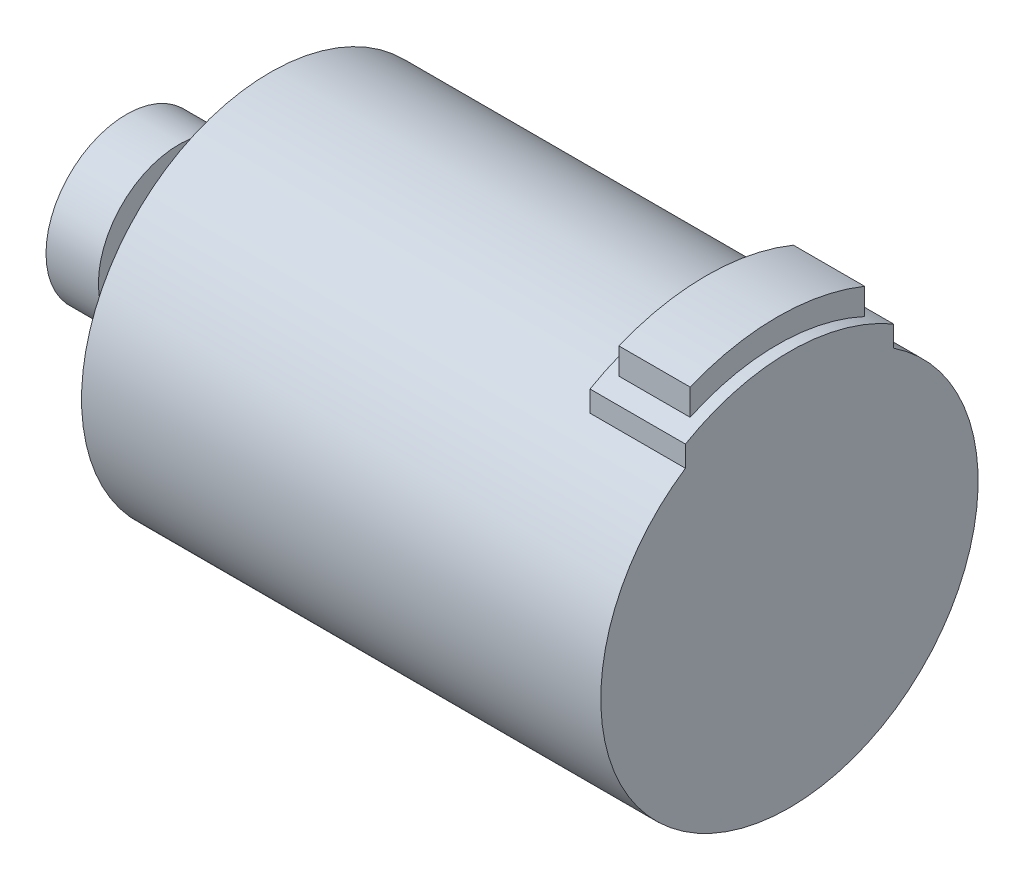
ISO-10303-21;
HEADER;
FILE_DESCRIPTION(('STEP AP214'),'2;1');
FILE_NAME('part.step','',(''),(''),'','','');
FILE_SCHEMA(('AUTOMOTIVE_DESIGN { 1 0 10303 214 1 1 1 1 }'));
ENDSEC;
DATA;
#1=APPLICATION_CONTEXT('core data for automotive mechanical design processes');
#2=APPLICATION_PROTOCOL_DEFINITION('international standard','automotive_design',2000,#1);
#3=PRODUCT_CONTEXT('',#1,'mechanical');
#4=PRODUCT('Part','Part','',(#3));
#5=PRODUCT_RELATED_PRODUCT_CATEGORY('part','',(#4));
#6=PRODUCT_DEFINITION_FORMATION('','',#4);
#7=PRODUCT_DEFINITION_CONTEXT('part definition',#1,'design');
#8=PRODUCT_DEFINITION('design','',#6,#7);
#9=PRODUCT_DEFINITION_SHAPE('','',#8);
#10=(LENGTH_UNIT() NAMED_UNIT(*) SI_UNIT(.MILLI.,.METRE.));
#11=(NAMED_UNIT(*) PLANE_ANGLE_UNIT() SI_UNIT($,.RADIAN.));
#12=(NAMED_UNIT(*) SI_UNIT($,.STERADIAN.) SOLID_ANGLE_UNIT());
#13=UNCERTAINTY_MEASURE_WITH_UNIT(LENGTH_MEASURE(1.E-05),#10,'distance_accuracy_value','');
#14=(GEOMETRIC_REPRESENTATION_CONTEXT(3) GLOBAL_UNCERTAINTY_ASSIGNED_CONTEXT((#13)) GLOBAL_UNIT_ASSIGNED_CONTEXT((#10,
#11,#12)) REPRESENTATION_CONTEXT('',''));
#15=CARTESIAN_POINT('',(0.,0.,0.));
#16=DIRECTION('',(0.,0.,1.));
#17=DIRECTION('',(1.,0.,0.));
#18=AXIS2_PLACEMENT_3D('',#15,#16,#17);
#19=CARTESIAN_POINT('',(49.54,0.,0.));
#20=DIRECTION('',(-1.,0.,0.));
#21=DIRECTION('',(0.,0.,1.));
#22=AXIS2_PLACEMENT_3D('',#19,#20,#21);
#23=CYLINDRICAL_SURFACE('',#22,18.);
#24=CARTESIAN_POINT('',(0.,0.,0.));
#25=DIRECTION('',(1.,0.,0.));
#26=DIRECTION('',(0.,0.,-1.));
#27=AXIS2_PLACEMENT_3D('',#24,#25,#26);
#28=CIRCLE('',#27,18.);
#29=CARTESIAN_POINT('',(0.,0.,-18.));
#30=VERTEX_POINT('',#29);
#31=EDGE_CURVE('E240',#30,#30,#28,.T.);
#32=ORIENTED_EDGE('',*,*,#31,.T.);
#33=EDGE_LOOP('',(#32));
#34=FACE_BOUND('',#33,.T.);
#35=DIRECTION('',(1.,0.,0.));
#36=VECTOR('',#35,1.);
#37=CARTESIAN_POINT('',(40.44,15.0164701245,9.925));
#38=LINE('',#37,#36);
#39=CARTESIAN_POINT('',(40.44,15.0164701245,9.925));
#40=VERTEX_POINT('',#39);
#41=CARTESIAN_POINT('',(49.54,15.0164701245,9.925));
#42=VERTEX_POINT('',#41);
#43=EDGE_CURVE('E173',#40,#42,#38,.T.);
#44=ORIENTED_EDGE('',*,*,#43,.F.);
#45=CARTESIAN_POINT('',(40.44,0.,0.));
#46=DIRECTION('',(1.,0.,0.));
#47=DIRECTION('',(0.,0.,-1.));
#48=AXIS2_PLACEMENT_3D('',#45,#46,#47);
#49=CIRCLE('',#48,18.);
#50=CARTESIAN_POINT('',(40.44,15.0164701245,-9.925));
#51=VERTEX_POINT('',#50);
#52=EDGE_CURVE('E155',#51,#40,#49,.T.);
#53=ORIENTED_EDGE('',*,*,#52,.F.);
#54=DIRECTION('',(1.,0.,0.));
#55=VECTOR('',#54,1.);
#56=CARTESIAN_POINT('',(40.44,15.0164701245,-9.925));
#57=LINE('',#56,#55);
#58=CARTESIAN_POINT('',(49.54,15.0164701245,-9.925));
#59=VERTEX_POINT('',#58);
#60=EDGE_CURVE('E166',#51,#59,#57,.T.);
#61=ORIENTED_EDGE('',*,*,#60,.T.);
#62=CARTESIAN_POINT('',(49.54,0.,0.));
#63=DIRECTION('',(1.,0.,0.));
#64=DIRECTION('',(0.,0.,-1.));
#65=AXIS2_PLACEMENT_3D('',#62,#63,#64);
#66=CIRCLE('',#65,18.);
#67=EDGE_CURVE('E241',#42,#59,#66,.T.);
#68=ORIENTED_EDGE('',*,*,#67,.F.);
#69=EDGE_LOOP('',(#44,#53,#61,#68));
#70=FACE_BOUND('',#69,.T.);
#71=ADVANCED_FACE('F37',(#34,#70),#23,.T.);
#72=CARTESIAN_POINT('',(-15.2,0.,0.));
#73=DIRECTION('',(1.,0.,0.));
#74=DIRECTION('',(0.,0.,-1.));
#75=AXIS2_PLACEMENT_3D('',#72,#73,#74);
#76=CYLINDRICAL_SURFACE('',#75,1.575);
#77=CARTESIAN_POINT('',(-2.5,0.,0.));
#78=DIRECTION('',(-1.,0.,0.));
#79=DIRECTION('',(0.,0.,1.));
#80=AXIS2_PLACEMENT_3D('',#77,#78,#79);
#81=CIRCLE('',#80,1.575);
#82=CARTESIAN_POINT('',(-2.5,0.,1.575));
#83=VERTEX_POINT('',#82);
#84=EDGE_CURVE('E235',#83,#83,#81,.T.);
#85=ORIENTED_EDGE('',*,*,#84,.T.);
#86=EDGE_LOOP('',(#85));
#87=FACE_BOUND('',#86,.T.);
#88=CARTESIAN_POINT('',(-4.69,0.,0.));
#89=DIRECTION('',(-1.,0.,0.));
#90=DIRECTION('',(0.,0.,1.));
#91=AXIS2_PLACEMENT_3D('',#88,#89,#90);
#92=CIRCLE('',#91,1.575);
#93=CARTESIAN_POINT('',(-4.69,0.,1.575));
#94=VERTEX_POINT('',#93);
#95=EDGE_CURVE('E11',#94,#94,#92,.T.);
#96=ORIENTED_EDGE('',*,*,#95,.F.);
#97=EDGE_LOOP('',(#96));
#98=FACE_BOUND('',#97,.T.);
#99=ADVANCED_FACE('F267',(#87,#98),#76,.T.);
#100=CARTESIAN_POINT('',(-2.5,0.,0.));
#101=DIRECTION('',(-1.,0.,0.));
#102=DIRECTION('',(0.,0.,1.));
#103=AXIS2_PLACEMENT_3D('',#100,#101,#102);
#104=PLANE('',#103);
#105=CARTESIAN_POINT('',(-2.5,0.,0.));
#106=DIRECTION('',(-1.,0.,0.));
#107=DIRECTION('',(0.,0.,1.));
#108=AXIS2_PLACEMENT_3D('',#105,#106,#107);
#109=CIRCLE('',#108,2.495);
#110=CARTESIAN_POINT('',(-2.5,0.,2.495));
#111=VERTEX_POINT('',#110);
#112=EDGE_CURVE('E234',#111,#111,#109,.T.);
#113=ORIENTED_EDGE('',*,*,#112,.T.);
#114=EDGE_LOOP('',(#113));
#115=FACE_BOUND('',#114,.T.);
#116=ORIENTED_EDGE('',*,*,#84,.F.);
#117=EDGE_LOOP('',(#116));
#118=FACE_BOUND('',#117,.T.);
#119=ADVANCED_FACE('F276',(#115,#118),#104,.T.);
#120=CARTESIAN_POINT('',(0.,0.,0.));
#121=DIRECTION('',(1.,0.,0.));
#122=DIRECTION('',(0.,0.,-1.));
#123=AXIS2_PLACEMENT_3D('',#120,#121,#122);
#124=PLANE('',#123);
#125=CARTESIAN_POINT('',(0.,0.,12.5));
#126=DIRECTION('',(-1.,0.,0.));
#127=DIRECTION('',(0.,0.,1.));
#128=AXIS2_PLACEMENT_3D('',#125,#126,#127);
#129=CIRCLE('',#128,1.24999999999999);
#130=CARTESIAN_POINT('',(0.,0.,13.75));
#131=VERTEX_POINT('',#130);
#132=EDGE_CURVE('E175',#131,#131,#129,.T.);
#133=ORIENTED_EDGE('',*,*,#132,.F.);
#134=EDGE_LOOP('',(#133));
#135=FACE_BOUND('',#134,.T.);
#136=CARTESIAN_POINT('',(0.,-10.8253175473055,6.25));
#137=DIRECTION('',(-1.,0.,0.));
#138=DIRECTION('',(0.,0.,1.));
#139=AXIS2_PLACEMENT_3D('',#136,#137,#138);
#140=CIRCLE('',#139,1.24999999999999);
#141=CARTESIAN_POINT('',(0.,-10.8253175473055,7.49999999999999));
#142=VERTEX_POINT('',#141);
#143=EDGE_CURVE('E188',#142,#142,#140,.T.);
#144=ORIENTED_EDGE('',*,*,#143,.F.);
#145=EDGE_LOOP('',(#144));
#146=FACE_BOUND('',#145,.T.);
#147=CARTESIAN_POINT('',(0.,-10.8253175473055,-6.25));
#148=DIRECTION('',(-1.,0.,0.));
#149=DIRECTION('',(0.,0.,1.));
#150=AXIS2_PLACEMENT_3D('',#147,#148,#149);
#151=CIRCLE('',#150,1.24999999999999);
#152=CARTESIAN_POINT('',(0.,-10.8253175473055,-5.00000000000001));
#153=VERTEX_POINT('',#152);
#154=EDGE_CURVE('E194',#153,#153,#151,.T.);
#155=ORIENTED_EDGE('',*,*,#154,.F.);
#156=EDGE_LOOP('',(#155));
#157=FACE_BOUND('',#156,.T.);
#158=CARTESIAN_POINT('',(0.,0.,-12.5));
#159=DIRECTION('',(-1.,0.,0.));
#160=DIRECTION('',(0.,0.,1.));
#161=AXIS2_PLACEMENT_3D('',#158,#159,#160);
#162=CIRCLE('',#161,1.24999999999999);
#163=CARTESIAN_POINT('',(0.,0.,-11.25));
#164=VERTEX_POINT('',#163);
#165=EDGE_CURVE('E200',#164,#164,#162,.T.);
#166=ORIENTED_EDGE('',*,*,#165,.F.);
#167=EDGE_LOOP('',(#166));
#168=FACE_BOUND('',#167,.T.);
#169=CARTESIAN_POINT('',(0.,10.8253175473055,-6.25000000000001));
#170=DIRECTION('',(-1.,0.,0.));
#171=DIRECTION('',(0.,0.,1.));
#172=AXIS2_PLACEMENT_3D('',#169,#170,#171);
#173=CIRCLE('',#172,1.24999999999999);
#174=CARTESIAN_POINT('',(0.,10.8253175473055,-5.00000000000002));
#175=VERTEX_POINT('',#174);
#176=EDGE_CURVE('E206',#175,#175,#173,.T.);
#177=ORIENTED_EDGE('',*,*,#176,.F.);
#178=EDGE_LOOP('',(#177));
#179=FACE_BOUND('',#178,.T.);
#180=CARTESIAN_POINT('',(0.,10.8253175473055,6.25));
#181=DIRECTION('',(-1.,0.,0.));
#182=DIRECTION('',(0.,0.,1.));
#183=AXIS2_PLACEMENT_3D('',#180,#181,#182);
#184=CIRCLE('',#183,1.24999999999999);
#185=CARTESIAN_POINT('',(0.,10.8253175473055,7.49999999999999));
#186=VERTEX_POINT('',#185);
#187=EDGE_CURVE('E212',#186,#186,#184,.T.);
#188=ORIENTED_EDGE('',*,*,#187,.F.);
#189=EDGE_LOOP('',(#188));
#190=FACE_BOUND('',#189,.T.);
#191=ORIENTED_EDGE('',*,*,#31,.F.);
#192=EDGE_LOOP('',(#191));
#193=FACE_BOUND('',#192,.T.);
#194=CARTESIAN_POINT('',(0.,0.,0.));
#195=DIRECTION('',(1.,0.,0.));
#196=DIRECTION('',(0.,0.,-1.));
#197=AXIS2_PLACEMENT_3D('',#194,#195,#196);
#198=CIRCLE('',#197,2.495);
#199=CARTESIAN_POINT('',(0.,0.,-2.495));
#200=VERTEX_POINT('',#199);
#201=EDGE_CURVE('E44',#200,#200,#198,.F.);
#202=ORIENTED_EDGE('',*,*,#201,.F.);
#203=EDGE_LOOP('',(#202));
#204=FACE_BOUND('',#203,.T.);
#205=ADVANCED_FACE('F389',(#135,#146,#157,#168,#179,#190,#193,#204),#124,.F.);
#206=CARTESIAN_POINT('',(49.54,0.,0.));
#207=DIRECTION('',(1.,0.,0.));
#208=DIRECTION('',(0.,0.,-1.));
#209=AXIS2_PLACEMENT_3D('',#206,#207,#208);
#210=PLANE('',#209);
#211=ORIENTED_EDGE('',*,*,#67,.T.);
#212=DIRECTION('',(0.,1.,0.));
#213=VECTOR('',#212,1.);
#214=CARTESIAN_POINT('',(49.54,0.,-9.925));
#215=LINE('',#214,#213);
#216=CARTESIAN_POINT('',(49.54,17.0164701245,-9.925));
#217=VERTEX_POINT('',#216);
#218=EDGE_CURVE('E154',#59,#217,#215,.T.);
#219=ORIENTED_EDGE('',*,*,#218,.T.);
#220=CARTESIAN_POINT('',(49.54,0.,0.));
#221=DIRECTION('',(1.,0.,0.));
#222=DIRECTION('',(0.,0.,-1.));
#223=AXIS2_PLACEMENT_3D('',#220,#221,#222);
#224=CIRCLE('',#223,19.6993878203867);
#225=CARTESIAN_POINT('',(49.54,17.0164701245,9.925));
#226=VERTEX_POINT('',#225);
#227=EDGE_CURVE('E169',#226,#217,#224,.F.);
#228=ORIENTED_EDGE('',*,*,#227,.F.);
#229=DIRECTION('',(0.,1.,0.));
#230=VECTOR('',#229,1.);
#231=CARTESIAN_POINT('',(49.54,0.,9.925));
#232=LINE('',#231,#230);
#233=EDGE_CURVE('E159',#42,#226,#232,.T.);
#234=ORIENTED_EDGE('',*,*,#233,.F.);
#235=EDGE_LOOP('',(#211,#219,#228,#234));
#236=FACE_BOUND('',#235,.T.);
#237=ADVANCED_FACE('F289',(#236),#210,.T.);
#238=CARTESIAN_POINT('',(-2.5,0.,0.));
#239=DIRECTION('',(1.,0.,0.));
#240=DIRECTION('',(0.,0.,-1.));
#241=AXIS2_PLACEMENT_3D('',#238,#239,#240);
#242=CYLINDRICAL_SURFACE('',#241,2.495);
#243=ORIENTED_EDGE('',*,*,#112,.F.);
#244=EDGE_LOOP('',(#243));
#245=FACE_BOUND('',#244,.T.);
#246=ORIENTED_EDGE('',*,*,#201,.T.);
#247=EDGE_LOOP('',(#246));
#248=FACE_BOUND('',#247,.T.);
#249=ADVANCED_FACE('F362',(#245,#248),#242,.T.);
#250=CARTESIAN_POINT('',(-4.69,0.,0.));
#251=DIRECTION('',(-1.,0.,0.));
#252=DIRECTION('',(0.,0.,1.));
#253=AXIS2_PLACEMENT_3D('',#250,#251,#252);
#254=PLANE('',#253);
#255=CARTESIAN_POINT('',(-4.69,0.,0.));
#256=DIRECTION('',(-1.,0.,0.));
#257=DIRECTION('',(0.,0.,1.));
#258=AXIS2_PLACEMENT_3D('',#255,#256,#257);
#259=CIRCLE('',#258,4.01);
#260=CARTESIAN_POINT('',(-4.69,0.,4.01));
#261=VERTEX_POINT('',#260);
#262=EDGE_CURVE('E218',#261,#261,#259,.T.);
#263=ORIENTED_EDGE('',*,*,#262,.F.);
#264=EDGE_LOOP('',(#263));
#265=FACE_BOUND('',#264,.T.);
#266=ORIENTED_EDGE('',*,*,#95,.T.);
#267=EDGE_LOOP('',(#266));
#268=FACE_BOUND('',#267,.T.);
#269=ADVANCED_FACE('F358',(#265,#268),#254,.F.);
#270=CARTESIAN_POINT('',(-4.69,0.,0.));
#271=DIRECTION('',(-1.,0.,0.));
#272=DIRECTION('',(0.,0.,1.));
#273=AXIS2_PLACEMENT_3D('',#270,#271,#272);
#274=CYLINDRICAL_SURFACE('',#273,4.01);
#275=ORIENTED_EDGE('',*,*,#262,.T.);
#276=EDGE_LOOP('',(#275));
#277=FACE_BOUND('',#276,.T.);
#278=CARTESIAN_POINT('',(-8.72,0.,0.));
#279=DIRECTION('',(-1.,0.,0.));
#280=DIRECTION('',(0.,0.,1.));
#281=AXIS2_PLACEMENT_3D('',#278,#279,#280);
#282=CIRCLE('',#281,4.01);
#283=CARTESIAN_POINT('',(-8.72,0.,4.01));
#284=VERTEX_POINT('',#283);
#285=EDGE_CURVE('E221',#284,#284,#282,.T.);
#286=ORIENTED_EDGE('',*,*,#285,.F.);
#287=EDGE_LOOP('',(#286));
#288=FACE_BOUND('',#287,.T.);
#289=ADVANCED_FACE('F361',(#277,#288),#274,.T.);
#290=CARTESIAN_POINT('',(-15.2,0.,0.));
#291=DIRECTION('',(-1.,0.,0.));
#292=DIRECTION('',(0.,0.,1.));
#293=AXIS2_PLACEMENT_3D('',#290,#291,#292);
#294=PLANE('',#293);
#295=CARTESIAN_POINT('',(-15.2,0.,0.));
#296=DIRECTION('',(-1.,0.,0.));
#297=DIRECTION('',(0.,0.,1.));
#298=AXIS2_PLACEMENT_3D('',#295,#296,#297);
#299=CIRCLE('',#298,1.575);
#300=CARTESIAN_POINT('',(-15.2,0.,1.575));
#301=VERTEX_POINT('',#300);
#302=EDGE_CURVE('E231',#301,#301,#299,.T.);
#303=ORIENTED_EDGE('',*,*,#302,.T.);
#304=EDGE_LOOP('',(#303));
#305=FACE_BOUND('',#304,.T.);
#306=ADVANCED_FACE('F265',(#305),#294,.T.);
#307=CARTESIAN_POINT('',(-13.72,0.,0.));
#308=DIRECTION('',(-1.,0.,0.));
#309=DIRECTION('',(0.,0.,1.));
#310=AXIS2_PLACEMENT_3D('',#307,#308,#309);
#311=CIRCLE('',#310,1.575);
#312=CARTESIAN_POINT('',(-13.72,0.,1.575));
#313=VERTEX_POINT('',#312);
#314=EDGE_CURVE('E228',#313,#313,#311,.T.);
#315=ORIENTED_EDGE('',*,*,#314,.T.);
#316=EDGE_LOOP('',(#315));
#317=FACE_BOUND('',#316,.T.);
#318=ORIENTED_EDGE('',*,*,#302,.F.);
#319=EDGE_LOOP('',(#318));
#320=FACE_BOUND('',#319,.T.);
#321=ADVANCED_FACE('F250',(#317,#320),#76,.T.);
#322=CARTESIAN_POINT('',(-13.72,0.,0.));
#323=DIRECTION('',(-1.,0.,0.));
#324=DIRECTION('',(0.,0.,1.));
#325=AXIS2_PLACEMENT_3D('',#322,#323,#324);
#326=PLANE('',#325);
#327=CARTESIAN_POINT('',(-13.72,0.,0.));
#328=DIRECTION('',(-1.,0.,0.));
#329=DIRECTION('',(0.,0.,1.));
#330=AXIS2_PLACEMENT_3D('',#327,#328,#329);
#331=CIRCLE('',#330,7.67);
#332=CARTESIAN_POINT('',(-13.72,0.,7.67));
#333=VERTEX_POINT('',#332);
#334=EDGE_CURVE('E224',#333,#333,#331,.T.);
#335=ORIENTED_EDGE('',*,*,#334,.T.);
#336=EDGE_LOOP('',(#335));
#337=FACE_BOUND('',#336,.T.);
#338=ORIENTED_EDGE('',*,*,#314,.F.);
#339=EDGE_LOOP('',(#338));
#340=FACE_BOUND('',#339,.T.);
#341=ADVANCED_FACE('F253',(#337,#340),#326,.T.);
#342=CARTESIAN_POINT('',(-8.72,0.,0.));
#343=DIRECTION('',(-1.,0.,0.));
#344=DIRECTION('',(0.,0.,1.));
#345=AXIS2_PLACEMENT_3D('',#342,#343,#344);
#346=CYLINDRICAL_SURFACE('',#345,7.67);
#347=CARTESIAN_POINT('',(-8.72,0.,0.));
#348=DIRECTION('',(-1.,0.,0.));
#349=DIRECTION('',(0.,0.,1.));
#350=AXIS2_PLACEMENT_3D('',#347,#348,#349);
#351=CIRCLE('',#350,7.67);
#352=CARTESIAN_POINT('',(-8.72,0.,7.67));
#353=VERTEX_POINT('',#352);
#354=EDGE_CURVE('E225',#353,#353,#351,.T.);
#355=ORIENTED_EDGE('',*,*,#354,.T.);
#356=EDGE_LOOP('',(#355));
#357=FACE_BOUND('',#356,.T.);
#358=ORIENTED_EDGE('',*,*,#334,.F.);
#359=EDGE_LOOP('',(#358));
#360=FACE_BOUND('',#359,.T.);
#361=ADVANCED_FACE('F255',(#357,#360),#346,.T.);
#362=CARTESIAN_POINT('',(-8.72,0.,0.));
#363=DIRECTION('',(-1.,0.,0.));
#364=DIRECTION('',(0.,0.,1.));
#365=AXIS2_PLACEMENT_3D('',#362,#363,#364);
#366=PLANE('',#365);
#367=ORIENTED_EDGE('',*,*,#285,.T.);
#368=EDGE_LOOP('',(#367));
#369=FACE_BOUND('',#368,.T.);
#370=ORIENTED_EDGE('',*,*,#354,.F.);
#371=EDGE_LOOP('',(#370));
#372=FACE_BOUND('',#371,.T.);
#373=ADVANCED_FACE('F262',(#369,#372),#366,.F.);
#374=CARTESIAN_POINT('',(9.00000000000001,10.8253175473055,6.25));
#375=DIRECTION('',(-1.,0.,0.));
#376=DIRECTION('',(0.,0.,1.));
#377=AXIS2_PLACEMENT_3D('',#374,#375,#376);
#378=CONICAL_SURFACE('',#377,1.24999999999999,1.02974425867665);
#379=CARTESIAN_POINT('',(9.75107577378445,10.8253175473055,6.25));
#380=VERTEX_POINT('',#379);
#381=VERTEX_LOOP('',#380);
#382=FACE_BOUND('',#381,.T.);
#383=CARTESIAN_POINT('',(9.00000000000001,10.8253175473055,6.25));
#384=DIRECTION('',(-1.,0.,0.));
#385=DIRECTION('',(0.,0.,1.));
#386=AXIS2_PLACEMENT_3D('',#383,#384,#385);
#387=CIRCLE('',#386,1.24999999999999);
#388=CARTESIAN_POINT('',(9.00000000000001,10.8253175473055,7.49999999999999));
#389=VERTEX_POINT('',#388);
#390=EDGE_CURVE('E215',#389,#389,#387,.T.);
#391=ORIENTED_EDGE('',*,*,#390,.T.);
#392=EDGE_LOOP('',(#391));
#393=FACE_BOUND('',#392,.T.);
#394=ADVANCED_FACE('F353',(#382,#393),#378,.F.);
#395=CARTESIAN_POINT('',(0.,10.8253175473055,6.25));
#396=DIRECTION('',(-1.,0.,0.));
#397=DIRECTION('',(0.,0.,1.));
#398=AXIS2_PLACEMENT_3D('',#395,#396,#397);
#399=CYLINDRICAL_SURFACE('',#398,1.24999999999999);
#400=ORIENTED_EDGE('',*,*,#390,.F.);
#401=EDGE_LOOP('',(#400));
#402=FACE_BOUND('',#401,.T.);
#403=ORIENTED_EDGE('',*,*,#187,.T.);
#404=EDGE_LOOP('',(#403));
#405=FACE_BOUND('',#404,.T.);
#406=ADVANCED_FACE('F349',(#402,#405),#399,.F.);
#407=CARTESIAN_POINT('',(9.00000000000001,10.8253175473055,-6.25000000000001));
#408=DIRECTION('',(-1.,0.,0.));
#409=DIRECTION('',(0.,0.,1.));
#410=AXIS2_PLACEMENT_3D('',#407,#408,#409);
#411=CONICAL_SURFACE('',#410,1.24999999999999,1.02974425867665);
#412=CARTESIAN_POINT('',(9.75107577378445,10.8253175473055,-6.25000000000001));
#413=VERTEX_POINT('',#412);
#414=VERTEX_LOOP('',#413);
#415=FACE_BOUND('',#414,.T.);
#416=CARTESIAN_POINT('',(9.00000000000001,10.8253175473055,-6.25000000000001));
#417=DIRECTION('',(-1.,0.,0.));
#418=DIRECTION('',(0.,0.,1.));
#419=AXIS2_PLACEMENT_3D('',#416,#417,#418);
#420=CIRCLE('',#419,1.24999999999999);
#421=CARTESIAN_POINT('',(9.00000000000001,10.8253175473055,-5.00000000000002));
#422=VERTEX_POINT('',#421);
#423=EDGE_CURVE('E209',#422,#422,#420,.T.);
#424=ORIENTED_EDGE('',*,*,#423,.T.);
#425=EDGE_LOOP('',(#424));
#426=FACE_BOUND('',#425,.T.);
#427=ADVANCED_FACE('F345',(#415,#426),#411,.F.);
#428=CARTESIAN_POINT('',(0.,10.8253175473055,-6.25000000000001));
#429=DIRECTION('',(-1.,0.,0.));
#430=DIRECTION('',(0.,0.,1.));
#431=AXIS2_PLACEMENT_3D('',#428,#429,#430);
#432=CYLINDRICAL_SURFACE('',#431,1.24999999999999);
#433=ORIENTED_EDGE('',*,*,#423,.F.);
#434=EDGE_LOOP('',(#433));
#435=FACE_BOUND('',#434,.T.);
#436=ORIENTED_EDGE('',*,*,#176,.T.);
#437=EDGE_LOOP('',(#436));
#438=FACE_BOUND('',#437,.T.);
#439=ADVANCED_FACE('F341',(#435,#438),#432,.F.);
#440=CARTESIAN_POINT('',(9.00000000000001,0.,-12.5));
#441=DIRECTION('',(-1.,0.,0.));
#442=DIRECTION('',(0.,0.,1.));
#443=AXIS2_PLACEMENT_3D('',#440,#441,#442);
#444=CONICAL_SURFACE('',#443,1.24999999999999,1.02974425867665);
#445=CARTESIAN_POINT('',(9.75107577378445,0.,-12.5));
#446=VERTEX_POINT('',#445);
#447=VERTEX_LOOP('',#446);
#448=FACE_BOUND('',#447,.T.);
#449=CARTESIAN_POINT('',(9.00000000000001,0.,-12.5));
#450=DIRECTION('',(-1.,0.,0.));
#451=DIRECTION('',(0.,0.,1.));
#452=AXIS2_PLACEMENT_3D('',#449,#450,#451);
#453=CIRCLE('',#452,1.24999999999999);
#454=CARTESIAN_POINT('',(9.00000000000001,0.,-11.25));
#455=VERTEX_POINT('',#454);
#456=EDGE_CURVE('E203',#455,#455,#453,.T.);
#457=ORIENTED_EDGE('',*,*,#456,.T.);
#458=EDGE_LOOP('',(#457));
#459=FACE_BOUND('',#458,.T.);
#460=ADVANCED_FACE('F337',(#448,#459),#444,.F.);
#461=CARTESIAN_POINT('',(0.,0.,-12.5));
#462=DIRECTION('',(-1.,0.,0.));
#463=DIRECTION('',(0.,0.,1.));
#464=AXIS2_PLACEMENT_3D('',#461,#462,#463);
#465=CYLINDRICAL_SURFACE('',#464,1.24999999999999);
#466=ORIENTED_EDGE('',*,*,#456,.F.);
#467=EDGE_LOOP('',(#466));
#468=FACE_BOUND('',#467,.T.);
#469=ORIENTED_EDGE('',*,*,#165,.T.);
#470=EDGE_LOOP('',(#469));
#471=FACE_BOUND('',#470,.T.);
#472=ADVANCED_FACE('F333',(#468,#471),#465,.F.);
#473=CARTESIAN_POINT('',(9.00000000000001,-10.8253175473055,-6.25));
#474=DIRECTION('',(-1.,0.,0.));
#475=DIRECTION('',(0.,0.,1.));
#476=AXIS2_PLACEMENT_3D('',#473,#474,#475);
#477=CONICAL_SURFACE('',#476,1.24999999999999,1.02974425867665);
#478=CARTESIAN_POINT('',(9.75107577378445,-10.8253175473055,-6.25));
#479=VERTEX_POINT('',#478);
#480=VERTEX_LOOP('',#479);
#481=FACE_BOUND('',#480,.T.);
#482=CARTESIAN_POINT('',(9.00000000000001,-10.8253175473055,-6.25));
#483=DIRECTION('',(-1.,0.,0.));
#484=DIRECTION('',(0.,0.,1.));
#485=AXIS2_PLACEMENT_3D('',#482,#483,#484);
#486=CIRCLE('',#485,1.24999999999999);
#487=CARTESIAN_POINT('',(9.00000000000001,-10.8253175473055,-5.00000000000001));
#488=VERTEX_POINT('',#487);
#489=EDGE_CURVE('E197',#488,#488,#486,.T.);
#490=ORIENTED_EDGE('',*,*,#489,.T.);
#491=EDGE_LOOP('',(#490));
#492=FACE_BOUND('',#491,.T.);
#493=ADVANCED_FACE('F329',(#481,#492),#477,.F.);
#494=CARTESIAN_POINT('',(0.,-10.8253175473055,-6.25));
#495=DIRECTION('',(-1.,0.,0.));
#496=DIRECTION('',(0.,0.,1.));
#497=AXIS2_PLACEMENT_3D('',#494,#495,#496);
#498=CYLINDRICAL_SURFACE('',#497,1.24999999999999);
#499=ORIENTED_EDGE('',*,*,#489,.F.);
#500=EDGE_LOOP('',(#499));
#501=FACE_BOUND('',#500,.T.);
#502=ORIENTED_EDGE('',*,*,#154,.T.);
#503=EDGE_LOOP('',(#502));
#504=FACE_BOUND('',#503,.T.);
#505=ADVANCED_FACE('F325',(#501,#504),#498,.F.);
#506=CARTESIAN_POINT('',(9.00000000000001,-10.8253175473055,6.25));
#507=DIRECTION('',(-1.,0.,0.));
#508=DIRECTION('',(0.,0.,1.));
#509=AXIS2_PLACEMENT_3D('',#506,#507,#508);
#510=CONICAL_SURFACE('',#509,1.24999999999999,1.02974425867665);
#511=CARTESIAN_POINT('',(9.75107577378445,-10.8253175473055,6.25));
#512=VERTEX_POINT('',#511);
#513=VERTEX_LOOP('',#512);
#514=FACE_BOUND('',#513,.T.);
#515=CARTESIAN_POINT('',(9.00000000000001,-10.8253175473055,6.25));
#516=DIRECTION('',(-1.,0.,0.));
#517=DIRECTION('',(0.,0.,1.));
#518=AXIS2_PLACEMENT_3D('',#515,#516,#517);
#519=CIRCLE('',#518,1.24999999999999);
#520=CARTESIAN_POINT('',(9.00000000000001,-10.8253175473055,7.49999999999999));
#521=VERTEX_POINT('',#520);
#522=EDGE_CURVE('E191',#521,#521,#519,.T.);
#523=ORIENTED_EDGE('',*,*,#522,.T.);
#524=EDGE_LOOP('',(#523));
#525=FACE_BOUND('',#524,.T.);
#526=ADVANCED_FACE('F321',(#514,#525),#510,.F.);
#527=CARTESIAN_POINT('',(0.,-10.8253175473055,6.25));
#528=DIRECTION('',(-1.,0.,0.));
#529=DIRECTION('',(0.,0.,1.));
#530=AXIS2_PLACEMENT_3D('',#527,#528,#529);
#531=CYLINDRICAL_SURFACE('',#530,1.24999999999999);
#532=ORIENTED_EDGE('',*,*,#522,.F.);
#533=EDGE_LOOP('',(#532));
#534=FACE_BOUND('',#533,.T.);
#535=ORIENTED_EDGE('',*,*,#143,.T.);
#536=EDGE_LOOP('',(#535));
#537=FACE_BOUND('',#536,.T.);
#538=ADVANCED_FACE('F317',(#534,#537),#531,.F.);
#539=CARTESIAN_POINT('',(9.00000000000001,0.,12.5));
#540=DIRECTION('',(-1.,0.,0.));
#541=DIRECTION('',(0.,0.,1.));
#542=AXIS2_PLACEMENT_3D('',#539,#540,#541);
#543=CONICAL_SURFACE('',#542,1.24999999999999,1.02974425867665);
#544=CARTESIAN_POINT('',(9.75107577378445,0.,12.5));
#545=VERTEX_POINT('',#544);
#546=VERTEX_LOOP('',#545);
#547=FACE_BOUND('',#546,.T.);
#548=CARTESIAN_POINT('',(9.00000000000001,0.,12.5));
#549=DIRECTION('',(-1.,0.,0.));
#550=DIRECTION('',(0.,0.,1.));
#551=AXIS2_PLACEMENT_3D('',#548,#549,#550);
#552=CIRCLE('',#551,1.24999999999999);
#553=CARTESIAN_POINT('',(9.00000000000001,0.,13.75));
#554=VERTEX_POINT('',#553);
#555=EDGE_CURVE('E185',#554,#554,#552,.T.);
#556=ORIENTED_EDGE('',*,*,#555,.T.);
#557=EDGE_LOOP('',(#556));
#558=FACE_BOUND('',#557,.T.);
#559=ADVANCED_FACE('F313',(#547,#558),#543,.F.);
#560=CARTESIAN_POINT('',(0.,0.,12.5));
#561=DIRECTION('',(-1.,0.,0.));
#562=DIRECTION('',(0.,0.,1.));
#563=AXIS2_PLACEMENT_3D('',#560,#561,#562);
#564=CYLINDRICAL_SURFACE('',#563,1.24999999999999);
#565=ORIENTED_EDGE('',*,*,#555,.F.);
#566=EDGE_LOOP('',(#565));
#567=FACE_BOUND('',#566,.T.);
#568=ORIENTED_EDGE('',*,*,#132,.T.);
#569=EDGE_LOOP('',(#568));
#570=FACE_BOUND('',#569,.T.);
#571=ADVANCED_FACE('F310',(#567,#570),#564,.F.);
#572=CARTESIAN_POINT('',(40.44,0.,9.925));
#573=DIRECTION('',(0.,0.,-1.));
#574=DIRECTION('',(-1.,0.,0.));
#575=AXIS2_PLACEMENT_3D('',#572,#573,#574);
#576=PLANE('',#575);
#577=ORIENTED_EDGE('',*,*,#233,.T.);
#578=DIRECTION('',(1.,0.,0.));
#579=VECTOR('',#578,1.);
#580=CARTESIAN_POINT('',(40.44,17.0164701245,9.925));
#581=LINE('',#580,#579);
#582=CARTESIAN_POINT('',(40.44,17.0164701245,9.925));
#583=VERTEX_POINT('',#582);
#584=EDGE_CURVE('E176',#583,#226,#581,.T.);
#585=ORIENTED_EDGE('',*,*,#584,.F.);
#586=DIRECTION('',(0.,1.,0.));
#587=VECTOR('',#586,1.);
#588=CARTESIAN_POINT('',(40.44,0.,9.925));
#589=LINE('',#588,#587);
#590=EDGE_CURVE('E164',#40,#583,#589,.T.);
#591=ORIENTED_EDGE('',*,*,#590,.F.);
#592=ORIENTED_EDGE('',*,*,#43,.T.);
#593=EDGE_LOOP('',(#577,#585,#591,#592));
#594=FACE_BOUND('',#593,.T.);
#595=ADVANCED_FACE('F285',(#594),#576,.F.);
#596=CARTESIAN_POINT('',(40.44,0.,0.));
#597=DIRECTION('',(1.,0.,0.));
#598=DIRECTION('',(0.,0.,-1.));
#599=AXIS2_PLACEMENT_3D('',#596,#597,#598);
#600=CYLINDRICAL_SURFACE('',#599,19.6993878203867);
#601=DIRECTION('',(-1.,0.,0.));
#602=VECTOR('',#601,1.);
#603=CARTESIAN_POINT('',(48.39,17.8538582804322,-8.32499999998842));
#604=LINE('',#603,#602);
#605=CARTESIAN_POINT('',(48.39,17.8538582804444,-8.32499999998842));
#606=VERTEX_POINT('',#605);
#607=CARTESIAN_POINT('',(41.59,17.8538582804444,-8.32499999998842));
#608=VERTEX_POINT('',#607);
#609=EDGE_CURVE('E56',#606,#608,#604,.T.);
#610=ORIENTED_EDGE('',*,*,#609,.F.);
#611=CARTESIAN_POINT('',(48.39,0.,0.));
#612=DIRECTION('',(1.,0.,0.));
#613=DIRECTION('',(0.,0.,-1.));
#614=AXIS2_PLACEMENT_3D('',#611,#612,#613);
#615=CIRCLE('',#614,19.6993878203867);
#616=CARTESIAN_POINT('',(48.39,17.8538582804444,8.32499999998842));
#617=VERTEX_POINT('',#616);
#618=EDGE_CURVE('E51',#606,#617,#615,.T.);
#619=ORIENTED_EDGE('',*,*,#618,.T.);
#620=DIRECTION('',(-1.,0.,0.));
#621=VECTOR('',#620,1.);
#622=CARTESIAN_POINT('',(48.39,17.8538582804422,8.3249999999931));
#623=LINE('',#622,#621);
#624=CARTESIAN_POINT('',(41.59,17.8538582804422,8.3249999999931));
#625=VERTEX_POINT('',#624);
#626=EDGE_CURVE('E152',#617,#625,#623,.T.);
#627=ORIENTED_EDGE('',*,*,#626,.T.);
#628=CARTESIAN_POINT('',(41.59,0.,0.));
#629=DIRECTION('',(1.,0.,0.));
#630=DIRECTION('',(0.,0.,-1.));
#631=AXIS2_PLACEMENT_3D('',#628,#629,#630);
#632=CIRCLE('',#631,19.6993878203867);
#633=EDGE_CURVE('E144',#608,#625,#632,.T.);
#634=ORIENTED_EDGE('',*,*,#633,.F.);
#635=EDGE_LOOP('',(#610,#619,#627,#634));
#636=FACE_BOUND('',#635,.T.);
#637=ORIENTED_EDGE('',*,*,#227,.T.);
#638=DIRECTION('',(1.,0.,0.));
#639=VECTOR('',#638,1.);
#640=CARTESIAN_POINT('',(40.44,17.0164701245,-9.925));
#641=LINE('',#640,#639);
#642=CARTESIAN_POINT('',(40.44,17.0164701245,-9.925));
#643=VERTEX_POINT('',#642);
#644=EDGE_CURVE('E179',#643,#217,#641,.T.);
#645=ORIENTED_EDGE('',*,*,#644,.F.);
#646=CARTESIAN_POINT('',(40.44,0.,0.));
#647=DIRECTION('',(1.,0.,0.));
#648=DIRECTION('',(0.,0.,-1.));
#649=AXIS2_PLACEMENT_3D('',#646,#647,#648);
#650=CIRCLE('',#649,19.6993878203867);
#651=EDGE_CURVE('E162',#583,#643,#650,.F.);
#652=ORIENTED_EDGE('',*,*,#651,.F.);
#653=ORIENTED_EDGE('',*,*,#584,.T.);
#654=EDGE_LOOP('',(#637,#645,#652,#653));
#655=FACE_BOUND('',#654,.T.);
#656=ADVANCED_FACE('F292',(#636,#655),#600,.T.);
#657=CARTESIAN_POINT('',(40.44,0.,-9.925));
#658=DIRECTION('',(0.,0.,-1.));
#659=DIRECTION('',(-1.,0.,0.));
#660=AXIS2_PLACEMENT_3D('',#657,#658,#659);
#661=PLANE('',#660);
#662=ORIENTED_EDGE('',*,*,#218,.F.);
#663=ORIENTED_EDGE('',*,*,#60,.F.);
#664=DIRECTION('',(0.,1.,0.));
#665=VECTOR('',#664,1.);
#666=CARTESIAN_POINT('',(40.44,0.,-9.925));
#667=LINE('',#666,#665);
#668=EDGE_CURVE('E158',#51,#643,#667,.T.);
#669=ORIENTED_EDGE('',*,*,#668,.T.);
#670=ORIENTED_EDGE('',*,*,#644,.T.);
#671=EDGE_LOOP('',(#662,#663,#669,#670));
#672=FACE_BOUND('',#671,.T.);
#673=ADVANCED_FACE('F298',(#672),#661,.T.);
#674=CARTESIAN_POINT('',(40.44,0.,0.));
#675=DIRECTION('',(1.,0.,0.));
#676=DIRECTION('',(0.,0.,-1.));
#677=AXIS2_PLACEMENT_3D('',#674,#675,#676);
#678=PLANE('',#677);
#679=ORIENTED_EDGE('',*,*,#52,.T.);
#680=ORIENTED_EDGE('',*,*,#590,.T.);
#681=ORIENTED_EDGE('',*,*,#651,.T.);
#682=ORIENTED_EDGE('',*,*,#668,.F.);
#683=EDGE_LOOP('',(#679,#680,#681,#682));
#684=FACE_BOUND('',#683,.T.);
#685=ADVANCED_FACE('F296',(#684),#678,.F.);
#686=CARTESIAN_POINT('',(48.39,-291578.415642788,8.32499999978609));
#687=DIRECTION('',(0.,0.,-1.));
#688=DIRECTION('',(0.,1.,0.));
#689=AXIS2_PLACEMENT_3D('',#686,#687,#688);
#690=PLANE('',#689);
#691=DIRECTION('',(0.,-1.,0.));
#692=VECTOR('',#691,1.);
#693=CARTESIAN_POINT('',(41.59,-291578.415642788,8.32499999978609));
#694=LINE('',#693,#692);
#695=CARTESIAN_POINT('',(41.59,20.3538582804417,8.32499999999326));
#696=VERTEX_POINT('',#695);
#697=EDGE_CURVE('E141',#696,#625,#694,.T.);
#698=ORIENTED_EDGE('',*,*,#697,.T.);
#699=ORIENTED_EDGE('',*,*,#626,.F.);
#700=DIRECTION('',(0.,-1.,0.));
#701=VECTOR('',#700,1.);
#702=CARTESIAN_POINT('',(48.39,-291578.415642788,8.32499999978609));
#703=LINE('',#702,#701);
#704=CARTESIAN_POINT('',(48.39,20.3538582804417,8.32499999999326));
#705=VERTEX_POINT('',#704);
#706=EDGE_CURVE('E137',#705,#617,#703,.T.);
#707=ORIENTED_EDGE('',*,*,#706,.F.);
#708=DIRECTION('',(-1.,0.,0.));
#709=VECTOR('',#708,1.);
#710=CARTESIAN_POINT('',(48.39,20.3538582804417,8.32499999999326));
#711=LINE('',#710,#709);
#712=EDGE_CURVE('E126',#705,#696,#711,.T.);
#713=ORIENTED_EDGE('',*,*,#712,.T.);
#714=EDGE_LOOP('',(#698,#699,#707,#713));
#715=FACE_BOUND('',#714,.T.);
#716=ADVANCED_FACE('F305',(#715),#690,.F.);
#717=CARTESIAN_POINT('',(48.39,-291578.415642789,-8.32499999978609));
#718=DIRECTION('',(0.,0.,-1.));
#719=DIRECTION('',(0.,1.,0.));
#720=AXIS2_PLACEMENT_3D('',#717,#718,#719);
#721=PLANE('',#720);
#722=DIRECTION('',(0.,-1.,0.));
#723=VECTOR('',#722,1.);
#724=CARTESIAN_POINT('',(41.59,-291578.415642789,-8.32499999978609));
#725=LINE('',#724,#723);
#726=CARTESIAN_POINT('',(41.59,20.3538582804417,-8.32499999999327));
#727=VERTEX_POINT('',#726);
#728=EDGE_CURVE('E123',#727,#608,#725,.T.);
#729=ORIENTED_EDGE('',*,*,#728,.F.);
#730=DIRECTION('',(-1.,0.,0.));
#731=VECTOR('',#730,1.);
#732=CARTESIAN_POINT('',(48.39,20.3538582804417,-8.32499999999327));
#733=LINE('',#732,#731);
#734=CARTESIAN_POINT('',(48.39,20.3538582804417,-8.32499999999327));
#735=VERTEX_POINT('',#734);
#736=EDGE_CURVE('E117',#735,#727,#733,.T.);
#737=ORIENTED_EDGE('',*,*,#736,.F.);
#738=DIRECTION('',(0.,-1.,0.));
#739=VECTOR('',#738,1.);
#740=CARTESIAN_POINT('',(48.39,-291578.415642789,-8.32499999978609));
#741=LINE('',#740,#739);
#742=EDGE_CURVE('E121',#735,#606,#741,.T.);
#743=ORIENTED_EDGE('',*,*,#742,.T.);
#744=ORIENTED_EDGE('',*,*,#609,.T.);
#745=EDGE_LOOP('',(#729,#737,#743,#744));
#746=FACE_BOUND('',#745,.T.);
#747=ADVANCED_FACE('F119',(#746),#721,.T.);
#748=CARTESIAN_POINT('',(48.39,0.,0.));
#749=DIRECTION('',(-1.,0.,0.));
#750=DIRECTION('',(0.,0.,1.));
#751=AXIS2_PLACEMENT_3D('',#748,#749,#750);
#752=CYLINDRICAL_SURFACE('',#751,21.9905700676493);
#753=CARTESIAN_POINT('',(41.59,0.,0.));
#754=DIRECTION('',(1.,0.,0.));
#755=DIRECTION('',(0.,0.,-1.));
#756=AXIS2_PLACEMENT_3D('',#753,#754,#755);
#757=CIRCLE('',#756,21.9905700676493);
#758=EDGE_CURVE('E148',#727,#696,#757,.T.);
#759=ORIENTED_EDGE('',*,*,#758,.T.);
#760=ORIENTED_EDGE('',*,*,#712,.F.);
#761=CARTESIAN_POINT('',(48.39,0.,0.));
#762=DIRECTION('',(1.,0.,0.));
#763=DIRECTION('',(0.,0.,-1.));
#764=AXIS2_PLACEMENT_3D('',#761,#762,#763);
#765=CIRCLE('',#764,21.9905700676493);
#766=EDGE_CURVE('E129',#735,#705,#765,.T.);
#767=ORIENTED_EDGE('',*,*,#766,.F.);
#768=ORIENTED_EDGE('',*,*,#736,.T.);
#769=EDGE_LOOP('',(#759,#760,#767,#768));
#770=FACE_BOUND('',#769,.T.);
#771=ADVANCED_FACE('F130',(#770),#752,.T.);
#772=CARTESIAN_POINT('',(48.39,0.,0.));
#773=DIRECTION('',(1.,0.,0.));
#774=DIRECTION('',(0.,0.,-1.));
#775=AXIS2_PLACEMENT_3D('',#772,#773,#774);
#776=PLANE('',#775);
#777=ORIENTED_EDGE('',*,*,#706,.T.);
#778=ORIENTED_EDGE('',*,*,#618,.F.);
#779=ORIENTED_EDGE('',*,*,#742,.F.);
#780=ORIENTED_EDGE('',*,*,#766,.T.);
#781=EDGE_LOOP('',(#777,#778,#779,#780));
#782=FACE_BOUND('',#781,.T.);
#783=ADVANCED_FACE('F135',(#782),#776,.T.);
#784=CARTESIAN_POINT('',(41.59,0.,0.));
#785=DIRECTION('',(1.,0.,0.));
#786=DIRECTION('',(0.,0.,-1.));
#787=AXIS2_PLACEMENT_3D('',#784,#785,#786);
#788=PLANE('',#787);
#789=ORIENTED_EDGE('',*,*,#697,.F.);
#790=ORIENTED_EDGE('',*,*,#758,.F.);
#791=ORIENTED_EDGE('',*,*,#728,.T.);
#792=ORIENTED_EDGE('',*,*,#633,.T.);
#793=EDGE_LOOP('',(#789,#790,#791,#792));
#794=FACE_BOUND('',#793,.T.);
#795=ADVANCED_FACE('F492',(#794),#788,.F.);
#796=CLOSED_SHELL('',(#71,#99,#119,#205,#237,#249,#269,#289,#306,#321,#341,#361,#373,#394,#406,
#427,#439,#460,#472,#493,#505,#526,#538,#559,#571,#595,#656,#673,#685,#716,#747,#771,#783,#795));
#797=MANIFOLD_SOLID_BREP('B2',#796);
#798=ADVANCED_BREP_SHAPE_REPRESENTATION('',(#18,#797),#14);
#799=SHAPE_DEFINITION_REPRESENTATION(#9,#798);
ENDSEC;
END-ISO-10303-21;
